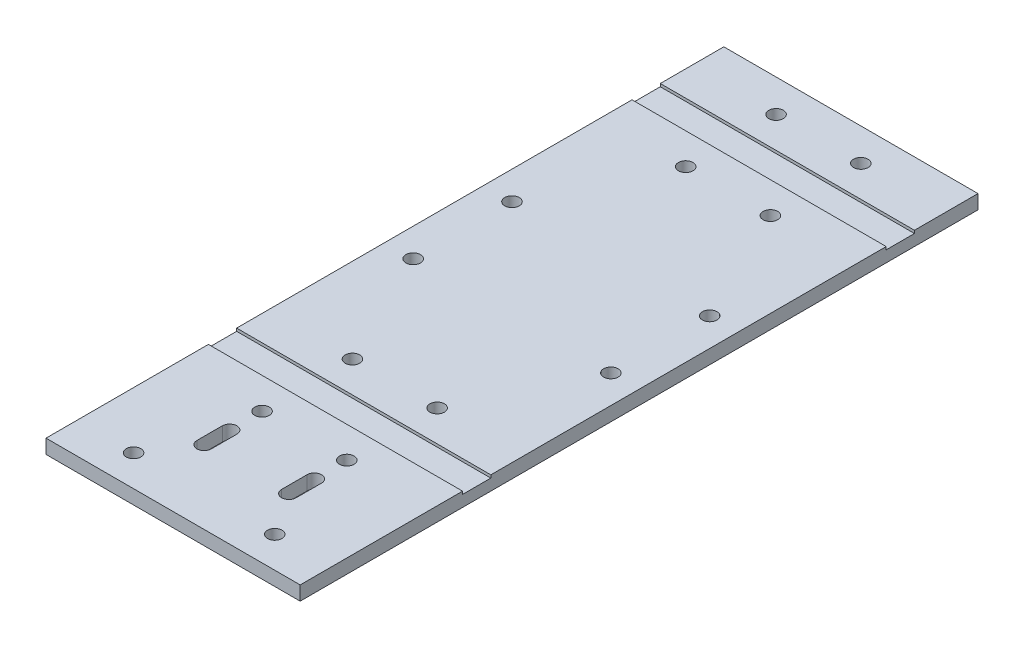
ISO-10303-21;
HEADER;
FILE_DESCRIPTION(('STEP AP214'),'2;1');
FILE_NAME('part.step','',(''),(''),'','','');
FILE_SCHEMA(('AUTOMOTIVE_DESIGN { 1 0 10303 214 1 1 1 1 }'));
ENDSEC;
DATA;
#1=APPLICATION_CONTEXT('core data for automotive mechanical design processes');
#2=APPLICATION_PROTOCOL_DEFINITION('international standard','automotive_design',2000,#1);
#3=PRODUCT_CONTEXT('',#1,'mechanical');
#4=PRODUCT('Part','Part','',(#3));
#5=PRODUCT_RELATED_PRODUCT_CATEGORY('part','',(#4));
#6=PRODUCT_DEFINITION_FORMATION('','',#4);
#7=PRODUCT_DEFINITION_CONTEXT('part definition',#1,'design');
#8=PRODUCT_DEFINITION('design','',#6,#7);
#9=PRODUCT_DEFINITION_SHAPE('','',#8);
#10=(LENGTH_UNIT() NAMED_UNIT(*) SI_UNIT(.MILLI.,.METRE.));
#11=(NAMED_UNIT(*) PLANE_ANGLE_UNIT() SI_UNIT($,.RADIAN.));
#12=(NAMED_UNIT(*) SI_UNIT($,.STERADIAN.) SOLID_ANGLE_UNIT());
#13=UNCERTAINTY_MEASURE_WITH_UNIT(LENGTH_MEASURE(1.E-05),#10,'distance_accuracy_value','');
#14=(GEOMETRIC_REPRESENTATION_CONTEXT(3) GLOBAL_UNCERTAINTY_ASSIGNED_CONTEXT((#13)) GLOBAL_UNIT_ASSIGNED_CONTEXT((#10,
#11,#12)) REPRESENTATION_CONTEXT('',''));
#15=CARTESIAN_POINT('',(0.,0.,0.));
#16=DIRECTION('',(0.,0.,1.));
#17=DIRECTION('',(1.,0.,0.));
#18=AXIS2_PLACEMENT_3D('',#15,#16,#17);
#19=CARTESIAN_POINT('',(-22.5,2.5,102.5));
#20=DIRECTION('',(0.,-1.,0.));
#21=DIRECTION('',(0.,0.,-1.));
#22=AXIS2_PLACEMENT_3D('',#19,#20,#21);
#23=PLANE('',#22);
#24=CARTESIAN_POINT('',(35.,2.5,17.5));
#25=DIRECTION('',(0.,-1.,0.));
#26=DIRECTION('',(0.,0.,1.));
#27=AXIS2_PLACEMENT_3D('',#24,#25,#26);
#28=CIRCLE('',#27,2.575);
#29=CARTESIAN_POINT('',(35.,2.5,20.075));
#30=VERTEX_POINT('',#29);
#31=EDGE_CURVE('E297',#30,#30,#28,.T.);
#32=ORIENTED_EDGE('',*,*,#31,.T.);
#33=EDGE_LOOP('',(#32));
#34=FACE_BOUND('',#33,.T.);
#35=CARTESIAN_POINT('',(35.,2.5,-17.5));
#36=DIRECTION('',(0.,-1.,0.));
#37=DIRECTION('',(0.,0.,1.));
#38=AXIS2_PLACEMENT_3D('',#35,#36,#37);
#39=CIRCLE('',#38,2.575);
#40=CARTESIAN_POINT('',(35.,2.5,-14.925));
#41=VERTEX_POINT('',#40);
#42=EDGE_CURVE('E280',#41,#41,#39,.T.);
#43=ORIENTED_EDGE('',*,*,#42,.T.);
#44=EDGE_LOOP('',(#43));
#45=FACE_BOUND('',#44,.T.);
#46=CARTESIAN_POINT('',(-35.,2.5,17.5));
#47=DIRECTION('',(0.,1.,0.));
#48=DIRECTION('',(0.,0.,1.));
#49=AXIS2_PLACEMENT_3D('',#46,#47,#48);
#50=CIRCLE('',#49,2.575);
#51=CARTESIAN_POINT('',(-35.,2.5,20.075));
#52=VERTEX_POINT('',#51);
#53=EDGE_CURVE('E313',#52,#52,#50,.T.);
#54=ORIENTED_EDGE('',*,*,#53,.F.);
#55=EDGE_LOOP('',(#54));
#56=FACE_BOUND('',#55,.T.);
#57=CARTESIAN_POINT('',(-35.,2.5,-17.5));
#58=DIRECTION('',(0.,1.,0.));
#59=DIRECTION('',(0.,0.,1.));
#60=AXIS2_PLACEMENT_3D('',#57,#58,#59);
#61=CIRCLE('',#60,2.575);
#62=CARTESIAN_POINT('',(-35.,2.5,-14.925));
#63=VERTEX_POINT('',#62);
#64=EDGE_CURVE('E317',#63,#63,#61,.T.);
#65=ORIENTED_EDGE('',*,*,#64,.F.);
#66=EDGE_LOOP('',(#65));
#67=FACE_BOUND('',#66,.T.);
#68=CARTESIAN_POINT('',(15.,2.5,59.));
#69=DIRECTION('',(0.,1.,0.));
#70=DIRECTION('',(0.,0.,1.));
#71=AXIS2_PLACEMENT_3D('',#68,#69,#70);
#72=CIRCLE('',#71,2.575);
#73=CARTESIAN_POINT('',(15.,2.5,61.575));
#74=VERTEX_POINT('',#73);
#75=EDGE_CURVE('E496',#74,#74,#72,.T.);
#76=ORIENTED_EDGE('',*,*,#75,.F.);
#77=EDGE_LOOP('',(#76));
#78=FACE_BOUND('',#77,.T.);
#79=CARTESIAN_POINT('',(-15.,2.5,59.));
#80=DIRECTION('',(0.,1.,0.));
#81=DIRECTION('',(0.,0.,1.));
#82=AXIS2_PLACEMENT_3D('',#79,#80,#81);
#83=CIRCLE('',#82,2.575);
#84=CARTESIAN_POINT('',(-15.,2.5,61.575));
#85=VERTEX_POINT('',#84);
#86=EDGE_CURVE('E48',#85,#85,#83,.T.);
#87=ORIENTED_EDGE('',*,*,#86,.F.);
#88=EDGE_LOOP('',(#87));
#89=FACE_BOUND('',#88,.T.);
#90=CARTESIAN_POINT('',(-15.,2.5,-59.));
#91=DIRECTION('',(0.,-1.,0.));
#92=DIRECTION('',(0.,0.,-1.));
#93=AXIS2_PLACEMENT_3D('',#90,#91,#92);
#94=CIRCLE('',#93,2.575);
#95=CARTESIAN_POINT('',(-15.,2.5,-61.575));
#96=VERTEX_POINT('',#95);
#97=EDGE_CURVE('E450',#96,#96,#94,.T.);
#98=ORIENTED_EDGE('',*,*,#97,.T.);
#99=EDGE_LOOP('',(#98));
#100=FACE_BOUND('',#99,.T.);
#101=CARTESIAN_POINT('',(15.,2.5,-59.));
#102=DIRECTION('',(0.,-1.,0.));
#103=DIRECTION('',(0.,0.,-1.));
#104=AXIS2_PLACEMENT_3D('',#101,#102,#103);
#105=CIRCLE('',#104,2.575);
#106=CARTESIAN_POINT('',(15.,2.5,-61.575));
#107=VERTEX_POINT('',#106);
#108=EDGE_CURVE('E451',#107,#107,#105,.T.);
#109=ORIENTED_EDGE('',*,*,#108,.T.);
#110=EDGE_LOOP('',(#109));
#111=FACE_BOUND('',#110,.T.);
#112=DIRECTION('',(1.,0.,0.));
#113=VECTOR('',#112,1.);
#114=CARTESIAN_POINT('',(-22.5,2.5,-70.));
#115=LINE('',#114,#113);
#116=CARTESIAN_POINT('',(-45.,2.5,-70.));
#117=VERTEX_POINT('',#116);
#118=CARTESIAN_POINT('',(45.,2.5,-70.));
#119=VERTEX_POINT('',#118);
#120=EDGE_CURVE('E426',#117,#119,#115,.T.);
#121=ORIENTED_EDGE('',*,*,#120,.F.);
#122=DIRECTION('',(0.,0.,1.));
#123=VECTOR('',#122,1.);
#124=CARTESIAN_POINT('',(-45.,2.5,-70.));
#125=LINE('',#124,#123);
#126=CARTESIAN_POINT('',(-45.,2.5,70.));
#127=VERTEX_POINT('',#126);
#128=EDGE_CURVE('E363',#117,#127,#125,.T.);
#129=ORIENTED_EDGE('',*,*,#128,.T.);
#130=DIRECTION('',(1.,0.,0.));
#131=VECTOR('',#130,1.);
#132=CARTESIAN_POINT('',(-22.5,2.5,70.));
#133=LINE('',#132,#131);
#134=CARTESIAN_POINT('',(45.,2.5,70.));
#135=VERTEX_POINT('',#134);
#136=EDGE_CURVE('E475',#127,#135,#133,.T.);
#137=ORIENTED_EDGE('',*,*,#136,.T.);
#138=DIRECTION('',(0.,0.,1.));
#139=VECTOR('',#138,1.);
#140=CARTESIAN_POINT('',(45.,2.5,-70.));
#141=LINE('',#140,#139);
#142=EDGE_CURVE('E379',#119,#135,#141,.T.);
#143=ORIENTED_EDGE('',*,*,#142,.F.);
#144=EDGE_LOOP('',(#121,#129,#137,#143));
#145=FACE_BOUND('',#144,.T.);
#146=ADVANCED_FACE('F44',(#34,#45,#56,#67,#78,#89,#100,#111,#145),#23,.F.);
#147=CARTESIAN_POINT('',(15.,2.5,-91.));
#148=DIRECTION('',(0.,-1.,0.));
#149=DIRECTION('',(0.,0.,-1.));
#150=AXIS2_PLACEMENT_3D('',#147,#148,#149);
#151=CIRCLE('',#150,2.575);
#152=CARTESIAN_POINT('',(15.,2.5,-93.575));
#153=VERTEX_POINT('',#152);
#154=EDGE_CURVE('E429',#153,#153,#151,.T.);
#155=ORIENTED_EDGE('',*,*,#154,.T.);
#156=EDGE_LOOP('',(#155));
#157=FACE_BOUND('',#156,.T.);
#158=CARTESIAN_POINT('',(-15.,2.5,-91.));
#159=DIRECTION('',(0.,-1.,0.));
#160=DIRECTION('',(0.,0.,-1.));
#161=AXIS2_PLACEMENT_3D('',#158,#159,#160);
#162=CIRCLE('',#161,2.575);
#163=CARTESIAN_POINT('',(-15.,2.5,-93.575));
#164=VERTEX_POINT('',#163);
#165=EDGE_CURVE('E442',#164,#164,#162,.T.);
#166=ORIENTED_EDGE('',*,*,#165,.T.);
#167=EDGE_LOOP('',(#166));
#168=FACE_BOUND('',#167,.T.);
#169=DIRECTION('',(1.,0.,0.));
#170=VECTOR('',#169,1.);
#171=CARTESIAN_POINT('',(-22.5,2.5,-80.));
#172=LINE('',#171,#170);
#173=CARTESIAN_POINT('',(-45.,2.5,-80.));
#174=VERTEX_POINT('',#173);
#175=CARTESIAN_POINT('',(45.,2.5,-80.));
#176=VERTEX_POINT('',#175);
#177=EDGE_CURVE('E430',#174,#176,#172,.T.);
#178=ORIENTED_EDGE('',*,*,#177,.T.);
#179=DIRECTION('',(0.,0.,1.));
#180=VECTOR('',#179,1.);
#181=CARTESIAN_POINT('',(45.,2.5,-102.5));
#182=LINE('',#181,#180);
#183=CARTESIAN_POINT('',(45.,2.5,-102.5));
#184=VERTEX_POINT('',#183);
#185=EDGE_CURVE('E411',#184,#176,#182,.T.);
#186=ORIENTED_EDGE('',*,*,#185,.F.);
#187=DIRECTION('',(-1.,0.,0.));
#188=VECTOR('',#187,1.);
#189=CARTESIAN_POINT('',(-22.5,2.5,-102.5));
#190=LINE('',#189,#188);
#191=CARTESIAN_POINT('',(-45.,2.5,-102.5));
#192=VERTEX_POINT('',#191);
#193=EDGE_CURVE('E472',#184,#192,#190,.T.);
#194=ORIENTED_EDGE('',*,*,#193,.T.);
#195=DIRECTION('',(0.,0.,1.));
#196=VECTOR('',#195,1.);
#197=CARTESIAN_POINT('',(-45.,2.5,-102.5));
#198=LINE('',#197,#196);
#199=EDGE_CURVE('E331',#192,#174,#198,.T.);
#200=ORIENTED_EDGE('',*,*,#199,.T.);
#201=EDGE_LOOP('',(#178,#186,#194,#200));
#202=FACE_BOUND('',#201,.T.);
#203=ADVANCED_FACE('F524',(#157,#168,#202),#23,.F.);
#204=DIRECTION('',(0.,0.,-1.));
#205=VECTOR('',#204,1.);
#206=CARTESIAN_POINT('',(-12.425,2.5,111.5));
#207=LINE('',#206,#205);
#208=CARTESIAN_POINT('',(-12.425,2.5,111.5));
#209=VERTEX_POINT('',#208);
#210=CARTESIAN_POINT('',(-12.425,2.5,102.5));
#211=VERTEX_POINT('',#210);
#212=EDGE_CURVE('E219',#209,#211,#207,.T.);
#213=ORIENTED_EDGE('',*,*,#212,.F.);
#214=CARTESIAN_POINT('',(-15.,2.5,111.5));
#215=DIRECTION('',(0.,1.,0.));
#216=DIRECTION('',(0.,0.,1.));
#217=AXIS2_PLACEMENT_3D('',#214,#215,#216);
#218=CIRCLE('',#217,2.575);
#219=CARTESIAN_POINT('',(-17.575,2.5,111.5));
#220=VERTEX_POINT('',#219);
#221=EDGE_CURVE('E60',#220,#209,#218,.T.);
#222=ORIENTED_EDGE('',*,*,#221,.F.);
#223=DIRECTION('',(0.,0.,1.));
#224=VECTOR('',#223,1.);
#225=CARTESIAN_POINT('',(-17.575,2.5,111.5));
#226=LINE('',#225,#224);
#227=CARTESIAN_POINT('',(-17.575,2.5,102.5));
#228=VERTEX_POINT('',#227);
#229=EDGE_CURVE('E206',#228,#220,#226,.T.);
#230=ORIENTED_EDGE('',*,*,#229,.F.);
#231=CARTESIAN_POINT('',(-15.,2.5,102.5));
#232=DIRECTION('',(0.,1.,0.));
#233=DIRECTION('',(0.,0.,1.));
#234=AXIS2_PLACEMENT_3D('',#231,#232,#233);
#235=CIRCLE('',#234,2.575);
#236=EDGE_CURVE('E210',#211,#228,#235,.T.);
#237=ORIENTED_EDGE('',*,*,#236,.F.);
#238=EDGE_LOOP('',(#213,#222,#230,#237));
#239=FACE_BOUND('',#238,.T.);
#240=DIRECTION('',(0.,0.,-1.));
#241=VECTOR('',#240,1.);
#242=CARTESIAN_POINT('',(17.575,2.5,111.5));
#243=LINE('',#242,#241);
#244=CARTESIAN_POINT('',(17.575,2.5,111.5));
#245=VERTEX_POINT('',#244);
#246=CARTESIAN_POINT('',(17.575,2.5,102.5));
#247=VERTEX_POINT('',#246);
#248=EDGE_CURVE('E256',#245,#247,#243,.T.);
#249=ORIENTED_EDGE('',*,*,#248,.F.);
#250=CARTESIAN_POINT('',(15.,2.5,111.5));
#251=DIRECTION('',(0.,1.,0.));
#252=DIRECTION('',(0.,0.,-1.));
#253=AXIS2_PLACEMENT_3D('',#250,#251,#252);
#254=CIRCLE('',#253,2.575);
#255=CARTESIAN_POINT('',(12.425,2.5,111.5));
#256=VERTEX_POINT('',#255);
#257=EDGE_CURVE('E68',#256,#245,#254,.T.);
#258=ORIENTED_EDGE('',*,*,#257,.F.);
#259=DIRECTION('',(0.,0.,1.));
#260=VECTOR('',#259,1.);
#261=CARTESIAN_POINT('',(12.425,2.5,111.5));
#262=LINE('',#261,#260);
#263=CARTESIAN_POINT('',(12.425,2.5,102.5));
#264=VERTEX_POINT('',#263);
#265=EDGE_CURVE('E247',#264,#256,#262,.T.);
#266=ORIENTED_EDGE('',*,*,#265,.F.);
#267=CARTESIAN_POINT('',(15.,2.5,102.5));
#268=DIRECTION('',(0.,1.,0.));
#269=DIRECTION('',(0.,0.,-1.));
#270=AXIS2_PLACEMENT_3D('',#267,#268,#269);
#271=CIRCLE('',#270,2.575);
#272=EDGE_CURVE('E251',#247,#264,#271,.T.);
#273=ORIENTED_EDGE('',*,*,#272,.F.);
#274=EDGE_LOOP('',(#249,#258,#266,#273));
#275=FACE_BOUND('',#274,.T.);
#276=CARTESIAN_POINT('',(-25.,2.5,126.5));
#277=DIRECTION('',(0.,1.,0.));
#278=DIRECTION('',(0.,0.,1.));
#279=AXIS2_PLACEMENT_3D('',#276,#277,#278);
#280=CIRCLE('',#279,2.57500000000002);
#281=CARTESIAN_POINT('',(-25.,2.5,129.075));
#282=VERTEX_POINT('',#281);
#283=EDGE_CURVE('E281',#282,#282,#280,.T.);
#284=ORIENTED_EDGE('',*,*,#283,.F.);
#285=EDGE_LOOP('',(#284));
#286=FACE_BOUND('',#285,.T.);
#287=CARTESIAN_POINT('',(25.,2.5,126.5));
#288=DIRECTION('',(0.,1.,0.));
#289=DIRECTION('',(0.,0.,-1.));
#290=AXIS2_PLACEMENT_3D('',#287,#288,#289);
#291=CIRCLE('',#290,2.57500000000002);
#292=CARTESIAN_POINT('',(25.,2.5,123.925));
#293=VERTEX_POINT('',#292);
#294=EDGE_CURVE('E285',#293,#293,#291,.T.);
#295=ORIENTED_EDGE('',*,*,#294,.F.);
#296=EDGE_LOOP('',(#295));
#297=FACE_BOUND('',#296,.T.);
#298=CARTESIAN_POINT('',(-15.,2.5,91.));
#299=DIRECTION('',(0.,1.,0.));
#300=DIRECTION('',(0.,0.,1.));
#301=AXIS2_PLACEMENT_3D('',#298,#299,#300);
#302=CIRCLE('',#301,2.575);
#303=CARTESIAN_POINT('',(-15.,2.5,93.575));
#304=VERTEX_POINT('',#303);
#305=EDGE_CURVE('E504',#304,#304,#302,.T.);
#306=ORIENTED_EDGE('',*,*,#305,.F.);
#307=EDGE_LOOP('',(#306));
#308=FACE_BOUND('',#307,.T.);
#309=CARTESIAN_POINT('',(15.,2.5,91.));
#310=DIRECTION('',(0.,1.,0.));
#311=DIRECTION('',(0.,0.,1.));
#312=AXIS2_PLACEMENT_3D('',#309,#310,#311);
#313=CIRCLE('',#312,2.575);
#314=CARTESIAN_POINT('',(15.,2.5,93.575));
#315=VERTEX_POINT('',#314);
#316=EDGE_CURVE('E488',#315,#315,#313,.T.);
#317=ORIENTED_EDGE('',*,*,#316,.F.);
#318=EDGE_LOOP('',(#317));
#319=FACE_BOUND('',#318,.T.);
#320=DIRECTION('',(-1.,0.,0.));
#321=VECTOR('',#320,1.);
#322=CARTESIAN_POINT('',(22.5,2.5,137.5));
#323=LINE('',#322,#321);
#324=CARTESIAN_POINT('',(45.,2.5,137.5));
#325=VERTEX_POINT('',#324);
#326=CARTESIAN_POINT('',(-45.,2.5,137.5));
#327=VERTEX_POINT('',#326);
#328=EDGE_CURVE('E422',#325,#327,#323,.T.);
#329=ORIENTED_EDGE('',*,*,#328,.F.);
#330=DIRECTION('',(0.,0.,1.));
#331=VECTOR('',#330,1.);
#332=CARTESIAN_POINT('',(45.,2.5,80.));
#333=LINE('',#332,#331);
#334=CARTESIAN_POINT('',(45.,2.5,80.));
#335=VERTEX_POINT('',#334);
#336=EDGE_CURVE('E395',#335,#325,#333,.T.);
#337=ORIENTED_EDGE('',*,*,#336,.F.);
#338=DIRECTION('',(1.,0.,0.));
#339=VECTOR('',#338,1.);
#340=CARTESIAN_POINT('',(-22.5,2.5,80.));
#341=LINE('',#340,#339);
#342=CARTESIAN_POINT('',(-45.,2.5,80.));
#343=VERTEX_POINT('',#342);
#344=EDGE_CURVE('E483',#343,#335,#341,.T.);
#345=ORIENTED_EDGE('',*,*,#344,.F.);
#346=DIRECTION('',(0.,0.,1.));
#347=VECTOR('',#346,1.);
#348=CARTESIAN_POINT('',(-45.,2.5,80.));
#349=LINE('',#348,#347);
#350=EDGE_CURVE('E347',#343,#327,#349,.T.);
#351=ORIENTED_EDGE('',*,*,#350,.T.);
#352=EDGE_LOOP('',(#329,#337,#345,#351));
#353=FACE_BOUND('',#352,.T.);
#354=ADVANCED_FACE('F46',(#239,#275,#286,#297,#308,#319,#353),#23,.F.);
#355=CARTESIAN_POINT('',(-22.5,-2.5,102.5));
#356=DIRECTION('',(0.,1.,0.));
#357=DIRECTION('',(0.,0.,1.));
#358=AXIS2_PLACEMENT_3D('',#355,#356,#357);
#359=PLANE('',#358);
#360=DIRECTION('',(0.,0.,1.));
#361=VECTOR('',#360,1.);
#362=CARTESIAN_POINT('',(-17.575,-2.5,111.5));
#363=LINE('',#362,#361);
#364=CARTESIAN_POINT('',(-17.575,-2.5,102.5));
#365=VERTEX_POINT('',#364);
#366=CARTESIAN_POINT('',(-17.575,-2.5,111.5));
#367=VERTEX_POINT('',#366);
#368=EDGE_CURVE('E191',#365,#367,#363,.T.);
#369=ORIENTED_EDGE('',*,*,#368,.T.);
#370=CARTESIAN_POINT('',(-15.,-2.5,111.5));
#371=DIRECTION('',(0.,1.,0.));
#372=DIRECTION('',(0.,0.,1.));
#373=AXIS2_PLACEMENT_3D('',#370,#371,#372);
#374=CIRCLE('',#373,2.575);
#375=CARTESIAN_POINT('',(-12.425,-2.5,111.5));
#376=VERTEX_POINT('',#375);
#377=EDGE_CURVE('E184',#367,#376,#374,.T.);
#378=ORIENTED_EDGE('',*,*,#377,.T.);
#379=DIRECTION('',(0.,0.,-1.));
#380=VECTOR('',#379,1.);
#381=CARTESIAN_POINT('',(-12.425,-2.5,111.5));
#382=LINE('',#381,#380);
#383=CARTESIAN_POINT('',(-12.425,-2.5,102.5));
#384=VERTEX_POINT('',#383);
#385=EDGE_CURVE('E195',#376,#384,#382,.T.);
#386=ORIENTED_EDGE('',*,*,#385,.T.);
#387=CARTESIAN_POINT('',(-15.,-2.5,102.5));
#388=DIRECTION('',(0.,1.,0.));
#389=DIRECTION('',(0.,0.,1.));
#390=AXIS2_PLACEMENT_3D('',#387,#388,#389);
#391=CIRCLE('',#390,2.575);
#392=EDGE_CURVE('E200',#384,#365,#391,.T.);
#393=ORIENTED_EDGE('',*,*,#392,.T.);
#394=EDGE_LOOP('',(#369,#378,#386,#393));
#395=FACE_BOUND('',#394,.T.);
#396=DIRECTION('',(0.,0.,1.));
#397=VECTOR('',#396,1.);
#398=CARTESIAN_POINT('',(12.425,-2.5,111.5));
#399=LINE('',#398,#397);
#400=CARTESIAN_POINT('',(12.425,-2.5,102.5));
#401=VERTEX_POINT('',#400);
#402=CARTESIAN_POINT('',(12.425,-2.5,111.5));
#403=VERTEX_POINT('',#402);
#404=EDGE_CURVE('E237',#401,#403,#399,.T.);
#405=ORIENTED_EDGE('',*,*,#404,.T.);
#406=CARTESIAN_POINT('',(15.,-2.5,111.5));
#407=DIRECTION('',(0.,1.,0.));
#408=DIRECTION('',(0.,0.,-1.));
#409=AXIS2_PLACEMENT_3D('',#406,#407,#408);
#410=CIRCLE('',#409,2.575);
#411=CARTESIAN_POINT('',(17.575,-2.5,111.5));
#412=VERTEX_POINT('',#411);
#413=EDGE_CURVE('E252',#403,#412,#410,.T.);
#414=ORIENTED_EDGE('',*,*,#413,.T.);
#415=DIRECTION('',(0.,0.,-1.));
#416=VECTOR('',#415,1.);
#417=CARTESIAN_POINT('',(17.575,-2.5,111.5));
#418=LINE('',#417,#416);
#419=CARTESIAN_POINT('',(17.575,-2.5,102.5));
#420=VERTEX_POINT('',#419);
#421=EDGE_CURVE('E269',#412,#420,#418,.T.);
#422=ORIENTED_EDGE('',*,*,#421,.T.);
#423=CARTESIAN_POINT('',(15.,-2.5,102.5));
#424=DIRECTION('',(0.,1.,0.));
#425=DIRECTION('',(0.,0.,-1.));
#426=AXIS2_PLACEMENT_3D('',#423,#424,#425);
#427=CIRCLE('',#426,2.575);
#428=EDGE_CURVE('E265',#420,#401,#427,.T.);
#429=ORIENTED_EDGE('',*,*,#428,.T.);
#430=EDGE_LOOP('',(#405,#414,#422,#429));
#431=FACE_BOUND('',#430,.T.);
#432=CARTESIAN_POINT('',(-25.,-2.5,126.5));
#433=DIRECTION('',(0.,1.,0.));
#434=DIRECTION('',(0.,0.,1.));
#435=AXIS2_PLACEMENT_3D('',#432,#433,#434);
#436=CIRCLE('',#435,2.57500000000002);
#437=CARTESIAN_POINT('',(-25.,-2.5,129.075));
#438=VERTEX_POINT('',#437);
#439=EDGE_CURVE('E276',#438,#438,#436,.T.);
#440=ORIENTED_EDGE('',*,*,#439,.T.);
#441=EDGE_LOOP('',(#440));
#442=FACE_BOUND('',#441,.T.);
#443=CARTESIAN_POINT('',(25.,-2.5,126.5));
#444=DIRECTION('',(0.,1.,0.));
#445=DIRECTION('',(0.,0.,-1.));
#446=AXIS2_PLACEMENT_3D('',#443,#444,#445);
#447=CIRCLE('',#446,2.57500000000002);
#448=CARTESIAN_POINT('',(25.,-2.5,123.925));
#449=VERTEX_POINT('',#448);
#450=EDGE_CURVE('E228',#449,#449,#447,.T.);
#451=ORIENTED_EDGE('',*,*,#450,.T.);
#452=EDGE_LOOP('',(#451));
#453=FACE_BOUND('',#452,.T.);
#454=CARTESIAN_POINT('',(35.,-2.5,17.5));
#455=DIRECTION('',(0.,-1.,0.));
#456=DIRECTION('',(0.,0.,1.));
#457=AXIS2_PLACEMENT_3D('',#454,#455,#456);
#458=CIRCLE('',#457,2.575);
#459=CARTESIAN_POINT('',(35.,-2.5,20.075));
#460=VERTEX_POINT('',#459);
#461=EDGE_CURVE('E292',#460,#460,#458,.T.);
#462=ORIENTED_EDGE('',*,*,#461,.F.);
#463=EDGE_LOOP('',(#462));
#464=FACE_BOUND('',#463,.T.);
#465=CARTESIAN_POINT('',(35.,-2.5,-17.5));
#466=DIRECTION('',(0.,-1.,0.));
#467=DIRECTION('',(0.,0.,1.));
#468=AXIS2_PLACEMENT_3D('',#465,#466,#467);
#469=CIRCLE('',#468,2.575);
#470=CARTESIAN_POINT('',(35.,-2.5,-14.925));
#471=VERTEX_POINT('',#470);
#472=EDGE_CURVE('E301',#471,#471,#469,.T.);
#473=ORIENTED_EDGE('',*,*,#472,.F.);
#474=EDGE_LOOP('',(#473));
#475=FACE_BOUND('',#474,.T.);
#476=CARTESIAN_POINT('',(-35.,-2.5,17.5));
#477=DIRECTION('',(0.,1.,0.));
#478=DIRECTION('',(0.,0.,1.));
#479=AXIS2_PLACEMENT_3D('',#476,#477,#478);
#480=CIRCLE('',#479,2.575);
#481=CARTESIAN_POINT('',(-35.,-2.5,20.075));
#482=VERTEX_POINT('',#481);
#483=EDGE_CURVE('E308',#482,#482,#480,.T.);
#484=ORIENTED_EDGE('',*,*,#483,.T.);
#485=EDGE_LOOP('',(#484));
#486=FACE_BOUND('',#485,.T.);
#487=CARTESIAN_POINT('',(-35.,-2.5,-17.5));
#488=DIRECTION('',(0.,1.,0.));
#489=DIRECTION('',(0.,0.,1.));
#490=AXIS2_PLACEMENT_3D('',#487,#488,#489);
#491=CIRCLE('',#490,2.575);
#492=CARTESIAN_POINT('',(-35.,-2.5,-14.925));
#493=VERTEX_POINT('',#492);
#494=EDGE_CURVE('E296',#493,#493,#491,.T.);
#495=ORIENTED_EDGE('',*,*,#494,.T.);
#496=EDGE_LOOP('',(#495));
#497=FACE_BOUND('',#496,.T.);
#498=CARTESIAN_POINT('',(15.,-2.5,-59.));
#499=DIRECTION('',(0.,-1.,0.));
#500=DIRECTION('',(0.,0.,-1.));
#501=AXIS2_PLACEMENT_3D('',#498,#499,#500);
#502=CIRCLE('',#501,2.575);
#503=CARTESIAN_POINT('',(15.,-2.5,-61.575));
#504=VERTEX_POINT('',#503);
#505=EDGE_CURVE('E446',#504,#504,#502,.T.);
#506=ORIENTED_EDGE('',*,*,#505,.F.);
#507=EDGE_LOOP('',(#506));
#508=FACE_BOUND('',#507,.T.);
#509=CARTESIAN_POINT('',(-15.,-2.5,-91.));
#510=DIRECTION('',(0.,-1.,0.));
#511=DIRECTION('',(0.,0.,-1.));
#512=AXIS2_PLACEMENT_3D('',#509,#510,#511);
#513=CIRCLE('',#512,2.575);
#514=CARTESIAN_POINT('',(-15.,-2.5,-93.575));
#515=VERTEX_POINT('',#514);
#516=EDGE_CURVE('E455',#515,#515,#513,.T.);
#517=ORIENTED_EDGE('',*,*,#516,.F.);
#518=EDGE_LOOP('',(#517));
#519=FACE_BOUND('',#518,.T.);
#520=CARTESIAN_POINT('',(15.,-2.5,-91.));
#521=DIRECTION('',(0.,-1.,0.));
#522=DIRECTION('',(0.,0.,-1.));
#523=AXIS2_PLACEMENT_3D('',#520,#521,#522);
#524=CIRCLE('',#523,2.575);
#525=CARTESIAN_POINT('',(15.,-2.5,-93.575));
#526=VERTEX_POINT('',#525);
#527=EDGE_CURVE('E438',#526,#526,#524,.T.);
#528=ORIENTED_EDGE('',*,*,#527,.F.);
#529=EDGE_LOOP('',(#528));
#530=FACE_BOUND('',#529,.T.);
#531=CARTESIAN_POINT('',(-15.,-2.5,-59.));
#532=DIRECTION('',(0.,-1.,0.));
#533=DIRECTION('',(0.,0.,-1.));
#534=AXIS2_PLACEMENT_3D('',#531,#532,#533);
#535=CIRCLE('',#534,2.575);
#536=CARTESIAN_POINT('',(-15.,-2.5,-61.575));
#537=VERTEX_POINT('',#536);
#538=EDGE_CURVE('E462',#537,#537,#535,.T.);
#539=ORIENTED_EDGE('',*,*,#538,.F.);
#540=EDGE_LOOP('',(#539));
#541=FACE_BOUND('',#540,.T.);
#542=CARTESIAN_POINT('',(15.,-2.5,59.));
#543=DIRECTION('',(0.,1.,0.));
#544=DIRECTION('',(0.,0.,1.));
#545=AXIS2_PLACEMENT_3D('',#542,#543,#544);
#546=CIRCLE('',#545,2.575);
#547=CARTESIAN_POINT('',(15.,-2.5,61.575));
#548=VERTEX_POINT('',#547);
#549=EDGE_CURVE('E500',#548,#548,#546,.T.);
#550=ORIENTED_EDGE('',*,*,#549,.T.);
#551=EDGE_LOOP('',(#550));
#552=FACE_BOUND('',#551,.T.);
#553=CARTESIAN_POINT('',(-15.,-2.5,91.));
#554=DIRECTION('',(0.,1.,0.));
#555=DIRECTION('',(0.,0.,1.));
#556=AXIS2_PLACEMENT_3D('',#553,#554,#555);
#557=CIRCLE('',#556,2.575);
#558=CARTESIAN_POINT('',(-15.,-2.5,93.575));
#559=VERTEX_POINT('',#558);
#560=EDGE_CURVE('E492',#559,#559,#557,.T.);
#561=ORIENTED_EDGE('',*,*,#560,.T.);
#562=EDGE_LOOP('',(#561));
#563=FACE_BOUND('',#562,.T.);
#564=CARTESIAN_POINT('',(15.,-2.5,91.));
#565=DIRECTION('',(0.,1.,0.));
#566=DIRECTION('',(0.,0.,1.));
#567=AXIS2_PLACEMENT_3D('',#564,#565,#566);
#568=CIRCLE('',#567,2.575);
#569=CARTESIAN_POINT('',(15.,-2.5,93.575));
#570=VERTEX_POINT('',#569);
#571=EDGE_CURVE('E479',#570,#570,#568,.T.);
#572=ORIENTED_EDGE('',*,*,#571,.T.);
#573=EDGE_LOOP('',(#572));
#574=FACE_BOUND('',#573,.T.);
#575=CARTESIAN_POINT('',(-15.,-2.5,59.));
#576=DIRECTION('',(0.,1.,0.));
#577=DIRECTION('',(0.,0.,1.));
#578=AXIS2_PLACEMENT_3D('',#575,#576,#577);
#579=CIRCLE('',#578,2.575);
#580=CARTESIAN_POINT('',(-15.,-2.5,61.575));
#581=VERTEX_POINT('',#580);
#582=EDGE_CURVE('E11',#581,#581,#579,.T.);
#583=ORIENTED_EDGE('',*,*,#582,.T.);
#584=EDGE_LOOP('',(#583));
#585=FACE_BOUND('',#584,.T.);
#586=DIRECTION('',(1.,0.,0.));
#587=VECTOR('',#586,1.);
#588=CARTESIAN_POINT('',(-22.5,-2.5,137.5));
#589=LINE('',#588,#587);
#590=CARTESIAN_POINT('',(-45.,-2.5,137.5));
#591=VERTEX_POINT('',#590);
#592=CARTESIAN_POINT('',(45.,-2.5,137.5));
#593=VERTEX_POINT('',#592);
#594=EDGE_CURVE('E419',#591,#593,#589,.T.);
#595=ORIENTED_EDGE('',*,*,#594,.F.);
#596=DIRECTION('',(0.,0.,-1.));
#597=VECTOR('',#596,1.);
#598=CARTESIAN_POINT('',(-45.,-2.5,137.5));
#599=LINE('',#598,#597);
#600=CARTESIAN_POINT('',(-45.,-2.5,-102.5));
#601=VERTEX_POINT('',#600);
#602=EDGE_CURVE('E339',#591,#601,#599,.T.);
#603=ORIENTED_EDGE('',*,*,#602,.T.);
#604=DIRECTION('',(1.,0.,0.));
#605=VECTOR('',#604,1.);
#606=CARTESIAN_POINT('',(-22.5,-2.5,-102.5));
#607=LINE('',#606,#605);
#608=CARTESIAN_POINT('',(45.,-2.5,-102.5));
#609=VERTEX_POINT('',#608);
#610=EDGE_CURVE('E466',#601,#609,#607,.T.);
#611=ORIENTED_EDGE('',*,*,#610,.T.);
#612=DIRECTION('',(0.,0.,-1.));
#613=VECTOR('',#612,1.);
#614=CARTESIAN_POINT('',(45.,-2.5,137.5));
#615=LINE('',#614,#613);
#616=EDGE_CURVE('E403',#593,#609,#615,.T.);
#617=ORIENTED_EDGE('',*,*,#616,.F.);
#618=EDGE_LOOP('',(#595,#603,#611,#617));
#619=FACE_BOUND('',#618,.T.);
#620=ADVANCED_FACE('F202',(#395,#431,#442,#453,#464,#475,#486,#497,#508,#519,#530,#541,#552,
#563,#574,#585,#619),#359,.F.);
#621=CARTESIAN_POINT('',(-15.,-2.5,59.));
#622=DIRECTION('',(0.,1.,0.));
#623=DIRECTION('',(0.,0.,1.));
#624=AXIS2_PLACEMENT_3D('',#621,#622,#623);
#625=CYLINDRICAL_SURFACE('',#624,2.575);
#626=ORIENTED_EDGE('',*,*,#582,.F.);
#627=EDGE_LOOP('',(#626));
#628=FACE_BOUND('',#627,.T.);
#629=ORIENTED_EDGE('',*,*,#86,.T.);
#630=EDGE_LOOP('',(#629));
#631=FACE_BOUND('',#630,.T.);
#632=ADVANCED_FACE('F636',(#628,#631),#625,.F.);
#633=CARTESIAN_POINT('',(15.,-2.5,91.));
#634=DIRECTION('',(0.,1.,0.));
#635=DIRECTION('',(0.,0.,1.));
#636=AXIS2_PLACEMENT_3D('',#633,#634,#635);
#637=CYLINDRICAL_SURFACE('',#636,2.575);
#638=ORIENTED_EDGE('',*,*,#571,.F.);
#639=EDGE_LOOP('',(#638));
#640=FACE_BOUND('',#639,.T.);
#641=ORIENTED_EDGE('',*,*,#316,.T.);
#642=EDGE_LOOP('',(#641));
#643=FACE_BOUND('',#642,.T.);
#644=ADVANCED_FACE('F518',(#640,#643),#637,.F.);
#645=CARTESIAN_POINT('',(-15.,-2.5,91.));
#646=DIRECTION('',(0.,1.,0.));
#647=DIRECTION('',(0.,0.,1.));
#648=AXIS2_PLACEMENT_3D('',#645,#646,#647);
#649=CYLINDRICAL_SURFACE('',#648,2.575);
#650=ORIENTED_EDGE('',*,*,#560,.F.);
#651=EDGE_LOOP('',(#650));
#652=FACE_BOUND('',#651,.T.);
#653=ORIENTED_EDGE('',*,*,#305,.T.);
#654=EDGE_LOOP('',(#653));
#655=FACE_BOUND('',#654,.T.);
#656=ADVANCED_FACE('F514',(#652,#655),#649,.F.);
#657=CARTESIAN_POINT('',(15.,-2.5,59.));
#658=DIRECTION('',(0.,1.,0.));
#659=DIRECTION('',(0.,0.,1.));
#660=AXIS2_PLACEMENT_3D('',#657,#658,#659);
#661=CYLINDRICAL_SURFACE('',#660,2.575);
#662=ORIENTED_EDGE('',*,*,#549,.F.);
#663=EDGE_LOOP('',(#662));
#664=FACE_BOUND('',#663,.T.);
#665=ORIENTED_EDGE('',*,*,#75,.T.);
#666=EDGE_LOOP('',(#665));
#667=FACE_BOUND('',#666,.T.);
#668=ADVANCED_FACE('F517',(#664,#667),#661,.F.);
#669=CARTESIAN_POINT('',(-22.5,2.5,70.));
#670=DIRECTION('',(0.,0.,-1.));
#671=DIRECTION('',(-1.,0.,0.));
#672=AXIS2_PLACEMENT_3D('',#669,#670,#671);
#673=PLANE('',#672);
#674=DIRECTION('',(1.,0.,0.));
#675=VECTOR('',#674,1.);
#676=CARTESIAN_POINT('',(-22.5,1.5,70.));
#677=LINE('',#676,#675);
#678=CARTESIAN_POINT('',(-45.,1.5,70.));
#679=VERTEX_POINT('',#678);
#680=CARTESIAN_POINT('',(45.,1.5,70.));
#681=VERTEX_POINT('',#680);
#682=EDGE_CURVE('E476',#679,#681,#677,.T.);
#683=ORIENTED_EDGE('',*,*,#682,.T.);
#684=DIRECTION('',(0.,-1.,0.));
#685=VECTOR('',#684,1.);
#686=CARTESIAN_POINT('',(45.,2.5,70.));
#687=LINE('',#686,#685);
#688=EDGE_CURVE('E383',#135,#681,#687,.T.);
#689=ORIENTED_EDGE('',*,*,#688,.F.);
#690=ORIENTED_EDGE('',*,*,#136,.F.);
#691=DIRECTION('',(0.,-1.,0.));
#692=VECTOR('',#691,1.);
#693=CARTESIAN_POINT('',(-45.,2.5,70.));
#694=LINE('',#693,#692);
#695=EDGE_CURVE('E359',#127,#679,#694,.T.);
#696=ORIENTED_EDGE('',*,*,#695,.T.);
#697=EDGE_LOOP('',(#683,#689,#690,#696));
#698=FACE_BOUND('',#697,.T.);
#699=ADVANCED_FACE('F566',(#698),#673,.F.);
#700=CARTESIAN_POINT('',(-22.5,1.5,70.));
#701=DIRECTION('',(0.,-1.,0.));
#702=DIRECTION('',(0.,0.,-1.));
#703=AXIS2_PLACEMENT_3D('',#700,#701,#702);
#704=PLANE('',#703);
#705=DIRECTION('',(1.,0.,0.));
#706=VECTOR('',#705,1.);
#707=CARTESIAN_POINT('',(-22.5,1.5,80.));
#708=LINE('',#707,#706);
#709=CARTESIAN_POINT('',(-45.,1.5,80.));
#710=VERTEX_POINT('',#709);
#711=CARTESIAN_POINT('',(45.,1.5,80.));
#712=VERTEX_POINT('',#711);
#713=EDGE_CURVE('E480',#710,#712,#708,.T.);
#714=ORIENTED_EDGE('',*,*,#713,.T.);
#715=DIRECTION('',(0.,0.,1.));
#716=VECTOR('',#715,1.);
#717=CARTESIAN_POINT('',(45.,1.5,70.));
#718=LINE('',#717,#716);
#719=EDGE_CURVE('E387',#681,#712,#718,.T.);
#720=ORIENTED_EDGE('',*,*,#719,.F.);
#721=ORIENTED_EDGE('',*,*,#682,.F.);
#722=DIRECTION('',(0.,0.,1.));
#723=VECTOR('',#722,1.);
#724=CARTESIAN_POINT('',(-45.,1.5,70.));
#725=LINE('',#724,#723);
#726=EDGE_CURVE('E355',#679,#710,#725,.T.);
#727=ORIENTED_EDGE('',*,*,#726,.T.);
#728=EDGE_LOOP('',(#714,#720,#721,#727));
#729=FACE_BOUND('',#728,.T.);
#730=ADVANCED_FACE('F570',(#729),#704,.F.);
#731=CARTESIAN_POINT('',(-22.5,2.5,80.));
#732=DIRECTION('',(0.,0.,1.));
#733=DIRECTION('',(1.,0.,0.));
#734=AXIS2_PLACEMENT_3D('',#731,#732,#733);
#735=PLANE('',#734);
#736=ORIENTED_EDGE('',*,*,#344,.T.);
#737=DIRECTION('',(0.,1.,0.));
#738=VECTOR('',#737,1.);
#739=CARTESIAN_POINT('',(45.,1.5,80.));
#740=LINE('',#739,#738);
#741=EDGE_CURVE('E391',#712,#335,#740,.T.);
#742=ORIENTED_EDGE('',*,*,#741,.F.);
#743=ORIENTED_EDGE('',*,*,#713,.F.);
#744=DIRECTION('',(0.,1.,0.));
#745=VECTOR('',#744,1.);
#746=CARTESIAN_POINT('',(-45.,1.5,80.));
#747=LINE('',#746,#745);
#748=EDGE_CURVE('E351',#710,#343,#747,.T.);
#749=ORIENTED_EDGE('',*,*,#748,.T.);
#750=EDGE_LOOP('',(#736,#742,#743,#749));
#751=FACE_BOUND('',#750,.T.);
#752=ADVANCED_FACE('F573',(#751),#735,.F.);
#753=CARTESIAN_POINT('',(0.,0.,-102.5));
#754=DIRECTION('',(0.,0.,1.));
#755=DIRECTION('',(-1.,0.,0.));
#756=AXIS2_PLACEMENT_3D('',#753,#754,#755);
#757=PLANE('',#756);
#758=ORIENTED_EDGE('',*,*,#193,.F.);
#759=DIRECTION('',(0.,1.,0.));
#760=VECTOR('',#759,1.);
#761=CARTESIAN_POINT('',(45.,-2.5,-102.5));
#762=LINE('',#761,#760);
#763=EDGE_CURVE('E407',#609,#184,#762,.T.);
#764=ORIENTED_EDGE('',*,*,#763,.F.);
#765=ORIENTED_EDGE('',*,*,#610,.F.);
#766=DIRECTION('',(0.,1.,0.));
#767=VECTOR('',#766,1.);
#768=CARTESIAN_POINT('',(-45.,-2.5,-102.5));
#769=LINE('',#768,#767);
#770=EDGE_CURVE('E335',#601,#192,#769,.T.);
#771=ORIENTED_EDGE('',*,*,#770,.T.);
#772=EDGE_LOOP('',(#758,#764,#765,#771));
#773=FACE_BOUND('',#772,.T.);
#774=ADVANCED_FACE('F547',(#773),#757,.F.);
#775=CARTESIAN_POINT('',(-15.,-2.5,-59.));
#776=DIRECTION('',(0.,1.,0.));
#777=DIRECTION('',(0.,0.,1.));
#778=AXIS2_PLACEMENT_3D('',#775,#776,#777);
#779=CYLINDRICAL_SURFACE('',#778,2.575);
#780=ORIENTED_EDGE('',*,*,#538,.T.);
#781=EDGE_LOOP('',(#780));
#782=FACE_BOUND('',#781,.T.);
#783=ORIENTED_EDGE('',*,*,#97,.F.);
#784=EDGE_LOOP('',(#783));
#785=FACE_BOUND('',#784,.T.);
#786=ADVANCED_FACE('F580',(#782,#785),#779,.F.);
#787=CARTESIAN_POINT('',(15.,-2.5,-91.));
#788=DIRECTION('',(0.,1.,0.));
#789=DIRECTION('',(0.,0.,1.));
#790=AXIS2_PLACEMENT_3D('',#787,#788,#789);
#791=CYLINDRICAL_SURFACE('',#790,2.575);
#792=ORIENTED_EDGE('',*,*,#527,.T.);
#793=EDGE_LOOP('',(#792));
#794=FACE_BOUND('',#793,.T.);
#795=ORIENTED_EDGE('',*,*,#154,.F.);
#796=EDGE_LOOP('',(#795));
#797=FACE_BOUND('',#796,.T.);
#798=ADVANCED_FACE('F620',(#794,#797),#791,.F.);
#799=CARTESIAN_POINT('',(-15.,-2.5,-91.));
#800=DIRECTION('',(0.,1.,0.));
#801=DIRECTION('',(0.,0.,1.));
#802=AXIS2_PLACEMENT_3D('',#799,#800,#801);
#803=CYLINDRICAL_SURFACE('',#802,2.575);
#804=ORIENTED_EDGE('',*,*,#516,.T.);
#805=EDGE_LOOP('',(#804));
#806=FACE_BOUND('',#805,.T.);
#807=ORIENTED_EDGE('',*,*,#165,.F.);
#808=EDGE_LOOP('',(#807));
#809=FACE_BOUND('',#808,.T.);
#810=ADVANCED_FACE('F612',(#806,#809),#803,.F.);
#811=CARTESIAN_POINT('',(15.,-2.5,-59.));
#812=DIRECTION('',(0.,1.,0.));
#813=DIRECTION('',(0.,0.,1.));
#814=AXIS2_PLACEMENT_3D('',#811,#812,#813);
#815=CYLINDRICAL_SURFACE('',#814,2.575);
#816=ORIENTED_EDGE('',*,*,#505,.T.);
#817=EDGE_LOOP('',(#816));
#818=FACE_BOUND('',#817,.T.);
#819=ORIENTED_EDGE('',*,*,#108,.F.);
#820=EDGE_LOOP('',(#819));
#821=FACE_BOUND('',#820,.T.);
#822=ADVANCED_FACE('F609',(#818,#821),#815,.F.);
#823=CARTESIAN_POINT('',(-22.5,2.5,-70.));
#824=DIRECTION('',(0.,0.,-1.));
#825=DIRECTION('',(-1.,0.,0.));
#826=AXIS2_PLACEMENT_3D('',#823,#824,#825);
#827=PLANE('',#826);
#828=ORIENTED_EDGE('',*,*,#120,.T.);
#829=DIRECTION('',(0.,1.,0.));
#830=VECTOR('',#829,1.);
#831=CARTESIAN_POINT('',(45.,1.5,-70.));
#832=LINE('',#831,#830);
#833=CARTESIAN_POINT('',(45.,1.5,-70.));
#834=VERTEX_POINT('',#833);
#835=EDGE_CURVE('E375',#834,#119,#832,.T.);
#836=ORIENTED_EDGE('',*,*,#835,.F.);
#837=DIRECTION('',(1.,0.,0.));
#838=VECTOR('',#837,1.);
#839=CARTESIAN_POINT('',(-22.5,1.5,-70.));
#840=LINE('',#839,#838);
#841=CARTESIAN_POINT('',(-45.,1.5,-70.));
#842=VERTEX_POINT('',#841);
#843=EDGE_CURVE('E425',#842,#834,#840,.T.);
#844=ORIENTED_EDGE('',*,*,#843,.F.);
#845=DIRECTION('',(0.,1.,0.));
#846=VECTOR('',#845,1.);
#847=CARTESIAN_POINT('',(-45.,1.5,-70.));
#848=LINE('',#847,#846);
#849=EDGE_CURVE('E367',#842,#117,#848,.T.);
#850=ORIENTED_EDGE('',*,*,#849,.T.);
#851=EDGE_LOOP('',(#828,#836,#844,#850));
#852=FACE_BOUND('',#851,.T.);
#853=ADVANCED_FACE('F611',(#852),#827,.T.);
#854=CARTESIAN_POINT('',(-22.5,2.5,-80.));
#855=DIRECTION('',(0.,0.,1.));
#856=DIRECTION('',(1.,0.,0.));
#857=AXIS2_PLACEMENT_3D('',#854,#855,#856);
#858=PLANE('',#857);
#859=DIRECTION('',(1.,0.,0.));
#860=VECTOR('',#859,1.);
#861=CARTESIAN_POINT('',(-22.5,1.5,-80.));
#862=LINE('',#861,#860);
#863=CARTESIAN_POINT('',(-45.,1.5,-80.));
#864=VERTEX_POINT('',#863);
#865=CARTESIAN_POINT('',(45.,1.5,-80.));
#866=VERTEX_POINT('',#865);
#867=EDGE_CURVE('E433',#864,#866,#862,.T.);
#868=ORIENTED_EDGE('',*,*,#867,.T.);
#869=DIRECTION('',(0.,-1.,0.));
#870=VECTOR('',#869,1.);
#871=CARTESIAN_POINT('',(45.,2.5,-80.));
#872=LINE('',#871,#870);
#873=EDGE_CURVE('E415',#176,#866,#872,.T.);
#874=ORIENTED_EDGE('',*,*,#873,.F.);
#875=ORIENTED_EDGE('',*,*,#177,.F.);
#876=DIRECTION('',(0.,-1.,0.));
#877=VECTOR('',#876,1.);
#878=CARTESIAN_POINT('',(-45.,2.5,-80.));
#879=LINE('',#878,#877);
#880=EDGE_CURVE('E327',#174,#864,#879,.T.);
#881=ORIENTED_EDGE('',*,*,#880,.T.);
#882=EDGE_LOOP('',(#868,#874,#875,#881));
#883=FACE_BOUND('',#882,.T.);
#884=ADVANCED_FACE('F553',(#883),#858,.T.);
#885=CARTESIAN_POINT('',(-22.5,1.5,-70.));
#886=DIRECTION('',(0.,1.,0.));
#887=DIRECTION('',(0.,0.,1.));
#888=AXIS2_PLACEMENT_3D('',#885,#886,#887);
#889=PLANE('',#888);
#890=ORIENTED_EDGE('',*,*,#843,.T.);
#891=DIRECTION('',(0.,0.,1.));
#892=VECTOR('',#891,1.);
#893=CARTESIAN_POINT('',(45.,1.5,-80.));
#894=LINE('',#893,#892);
#895=EDGE_CURVE('E371',#866,#834,#894,.T.);
#896=ORIENTED_EDGE('',*,*,#895,.F.);
#897=ORIENTED_EDGE('',*,*,#867,.F.);
#898=DIRECTION('',(0.,0.,1.));
#899=VECTOR('',#898,1.);
#900=CARTESIAN_POINT('',(-45.,1.5,-80.));
#901=LINE('',#900,#899);
#902=EDGE_CURVE('E312',#864,#842,#901,.T.);
#903=ORIENTED_EDGE('',*,*,#902,.T.);
#904=EDGE_LOOP('',(#890,#896,#897,#903));
#905=FACE_BOUND('',#904,.T.);
#906=ADVANCED_FACE('F557',(#905),#889,.T.);
#907=CARTESIAN_POINT('',(0.,0.,137.5));
#908=DIRECTION('',(0.,0.,1.));
#909=DIRECTION('',(1.,0.,0.));
#910=AXIS2_PLACEMENT_3D('',#907,#908,#909);
#911=PLANE('',#910);
#912=ORIENTED_EDGE('',*,*,#594,.T.);
#913=DIRECTION('',(0.,-1.,0.));
#914=VECTOR('',#913,1.);
#915=CARTESIAN_POINT('',(45.,2.5,137.5));
#916=LINE('',#915,#914);
#917=EDGE_CURVE('E399',#325,#593,#916,.T.);
#918=ORIENTED_EDGE('',*,*,#917,.F.);
#919=ORIENTED_EDGE('',*,*,#328,.T.);
#920=DIRECTION('',(0.,-1.,0.));
#921=VECTOR('',#920,1.);
#922=CARTESIAN_POINT('',(-45.,2.5,137.5));
#923=LINE('',#922,#921);
#924=EDGE_CURVE('E343',#327,#591,#923,.T.);
#925=ORIENTED_EDGE('',*,*,#924,.T.);
#926=EDGE_LOOP('',(#912,#918,#919,#925));
#927=FACE_BOUND('',#926,.T.);
#928=ADVANCED_FACE('F537',(#927),#911,.T.);
#929=CARTESIAN_POINT('',(45.,0.,0.));
#930=DIRECTION('',(-1.,0.,0.));
#931=DIRECTION('',(0.,0.,1.));
#932=AXIS2_PLACEMENT_3D('',#929,#930,#931);
#933=PLANE('',#932);
#934=ORIENTED_EDGE('',*,*,#895,.T.);
#935=ORIENTED_EDGE('',*,*,#835,.T.);
#936=ORIENTED_EDGE('',*,*,#142,.T.);
#937=ORIENTED_EDGE('',*,*,#688,.T.);
#938=ORIENTED_EDGE('',*,*,#719,.T.);
#939=ORIENTED_EDGE('',*,*,#741,.T.);
#940=ORIENTED_EDGE('',*,*,#336,.T.);
#941=ORIENTED_EDGE('',*,*,#917,.T.);
#942=ORIENTED_EDGE('',*,*,#616,.T.);
#943=ORIENTED_EDGE('',*,*,#763,.T.);
#944=ORIENTED_EDGE('',*,*,#185,.T.);
#945=ORIENTED_EDGE('',*,*,#873,.T.);
#946=EDGE_LOOP('',(#934,#935,#936,#937,#938,#939,#940,#941,#942,#943,#944,#945));
#947=FACE_BOUND('',#946,.T.);
#948=ADVANCED_FACE('F534',(#947),#933,.F.);
#949=CARTESIAN_POINT('',(-45.,0.,0.));
#950=DIRECTION('',(1.,0.,0.));
#951=DIRECTION('',(0.,0.,1.));
#952=AXIS2_PLACEMENT_3D('',#949,#950,#951);
#953=PLANE('',#952);
#954=ORIENTED_EDGE('',*,*,#902,.F.);
#955=ORIENTED_EDGE('',*,*,#880,.F.);
#956=ORIENTED_EDGE('',*,*,#199,.F.);
#957=ORIENTED_EDGE('',*,*,#770,.F.);
#958=ORIENTED_EDGE('',*,*,#602,.F.);
#959=ORIENTED_EDGE('',*,*,#924,.F.);
#960=ORIENTED_EDGE('',*,*,#350,.F.);
#961=ORIENTED_EDGE('',*,*,#748,.F.);
#962=ORIENTED_EDGE('',*,*,#726,.F.);
#963=ORIENTED_EDGE('',*,*,#695,.F.);
#964=ORIENTED_EDGE('',*,*,#128,.F.);
#965=ORIENTED_EDGE('',*,*,#849,.F.);
#966=EDGE_LOOP('',(#954,#955,#956,#957,#958,#959,#960,#961,#962,#963,#964,#965));
#967=FACE_BOUND('',#966,.T.);
#968=ADVANCED_FACE('F543',(#967),#953,.F.);
#969=CARTESIAN_POINT('',(-35.,-2.5,-17.5));
#970=DIRECTION('',(0.,1.,0.));
#971=DIRECTION('',(0.,0.,1.));
#972=AXIS2_PLACEMENT_3D('',#969,#970,#971);
#973=CYLINDRICAL_SURFACE('',#972,2.575);
#974=ORIENTED_EDGE('',*,*,#494,.F.);
#975=EDGE_LOOP('',(#974));
#976=FACE_BOUND('',#975,.T.);
#977=ORIENTED_EDGE('',*,*,#64,.T.);
#978=EDGE_LOOP('',(#977));
#979=FACE_BOUND('',#978,.T.);
#980=ADVANCED_FACE('F797',(#976,#979),#973,.F.);
#981=CARTESIAN_POINT('',(-35.,-2.5,17.5));
#982=DIRECTION('',(0.,1.,0.));
#983=DIRECTION('',(0.,0.,1.));
#984=AXIS2_PLACEMENT_3D('',#981,#982,#983);
#985=CYLINDRICAL_SURFACE('',#984,2.575);
#986=ORIENTED_EDGE('',*,*,#483,.F.);
#987=EDGE_LOOP('',(#986));
#988=FACE_BOUND('',#987,.T.);
#989=ORIENTED_EDGE('',*,*,#53,.T.);
#990=EDGE_LOOP('',(#989));
#991=FACE_BOUND('',#990,.T.);
#992=ADVANCED_FACE('F806',(#988,#991),#985,.F.);
#993=CARTESIAN_POINT('',(35.,-2.5,-17.5));
#994=DIRECTION('',(0.,1.,0.));
#995=DIRECTION('',(0.,0.,1.));
#996=AXIS2_PLACEMENT_3D('',#993,#994,#995);
#997=CYLINDRICAL_SURFACE('',#996,2.575);
#998=ORIENTED_EDGE('',*,*,#472,.T.);
#999=EDGE_LOOP('',(#998));
#1000=FACE_BOUND('',#999,.T.);
#1001=ORIENTED_EDGE('',*,*,#42,.F.);
#1002=EDGE_LOOP('',(#1001));
#1003=FACE_BOUND('',#1002,.T.);
#1004=ADVANCED_FACE('F816',(#1000,#1003),#997,.F.);
#1005=CARTESIAN_POINT('',(35.,-2.5,17.5));
#1006=DIRECTION('',(0.,1.,0.));
#1007=DIRECTION('',(0.,0.,1.));
#1008=AXIS2_PLACEMENT_3D('',#1005,#1006,#1007);
#1009=CYLINDRICAL_SURFACE('',#1008,2.575);
#1010=ORIENTED_EDGE('',*,*,#461,.T.);
#1011=EDGE_LOOP('',(#1010));
#1012=FACE_BOUND('',#1011,.T.);
#1013=ORIENTED_EDGE('',*,*,#31,.F.);
#1014=EDGE_LOOP('',(#1013));
#1015=FACE_BOUND('',#1014,.T.);
#1016=ADVANCED_FACE('F827',(#1012,#1015),#1009,.F.);
#1017=CARTESIAN_POINT('',(25.,-2.5,126.5));
#1018=DIRECTION('',(0.,1.,0.));
#1019=DIRECTION('',(0.,0.,1.));
#1020=AXIS2_PLACEMENT_3D('',#1017,#1018,#1019);
#1021=CYLINDRICAL_SURFACE('',#1020,2.57500000000002);
#1022=ORIENTED_EDGE('',*,*,#450,.F.);
#1023=EDGE_LOOP('',(#1022));
#1024=FACE_BOUND('',#1023,.T.);
#1025=ORIENTED_EDGE('',*,*,#294,.T.);
#1026=EDGE_LOOP('',(#1025));
#1027=FACE_BOUND('',#1026,.T.);
#1028=ADVANCED_FACE('F834',(#1024,#1027),#1021,.F.);
#1029=CARTESIAN_POINT('',(-25.,-2.5,126.5));
#1030=DIRECTION('',(0.,1.,0.));
#1031=DIRECTION('',(0.,0.,1.));
#1032=AXIS2_PLACEMENT_3D('',#1029,#1030,#1031);
#1033=CYLINDRICAL_SURFACE('',#1032,2.57500000000002);
#1034=ORIENTED_EDGE('',*,*,#439,.F.);
#1035=EDGE_LOOP('',(#1034));
#1036=FACE_BOUND('',#1035,.T.);
#1037=ORIENTED_EDGE('',*,*,#283,.T.);
#1038=EDGE_LOOP('',(#1037));
#1039=FACE_BOUND('',#1038,.T.);
#1040=ADVANCED_FACE('F842',(#1036,#1039),#1033,.F.);
#1041=CARTESIAN_POINT('',(15.,-2.5,111.5));
#1042=DIRECTION('',(0.,1.,0.));
#1043=DIRECTION('',(0.,0.,1.));
#1044=AXIS2_PLACEMENT_3D('',#1041,#1042,#1043);
#1045=CYLINDRICAL_SURFACE('',#1044,2.575);
#1046=ORIENTED_EDGE('',*,*,#257,.T.);
#1047=DIRECTION('',(0.,1.,0.));
#1048=VECTOR('',#1047,1.);
#1049=CARTESIAN_POINT('',(17.575,-2.5,111.5));
#1050=LINE('',#1049,#1048);
#1051=EDGE_CURVE('E234',#412,#245,#1050,.T.);
#1052=ORIENTED_EDGE('',*,*,#1051,.F.);
#1053=ORIENTED_EDGE('',*,*,#413,.F.);
#1054=DIRECTION('',(0.,1.,0.));
#1055=VECTOR('',#1054,1.);
#1056=CARTESIAN_POINT('',(12.425,-2.5,111.5));
#1057=LINE('',#1056,#1055);
#1058=EDGE_CURVE('E244',#403,#256,#1057,.T.);
#1059=ORIENTED_EDGE('',*,*,#1058,.T.);
#1060=EDGE_LOOP('',(#1046,#1052,#1053,#1059));
#1061=FACE_BOUND('',#1060,.T.);
#1062=ADVANCED_FACE('F850',(#1061),#1045,.F.);
#1063=CARTESIAN_POINT('',(12.425,-2.5,111.5));
#1064=DIRECTION('',(-1.,0.,0.));
#1065=DIRECTION('',(0.,0.,1.));
#1066=AXIS2_PLACEMENT_3D('',#1063,#1064,#1065);
#1067=PLANE('',#1066);
#1068=ORIENTED_EDGE('',*,*,#265,.T.);
#1069=ORIENTED_EDGE('',*,*,#1058,.F.);
#1070=ORIENTED_EDGE('',*,*,#404,.F.);
#1071=DIRECTION('',(0.,1.,0.));
#1072=VECTOR('',#1071,1.);
#1073=CARTESIAN_POINT('',(12.425,-2.5,102.5));
#1074=LINE('',#1073,#1072);
#1075=EDGE_CURVE('E241',#401,#264,#1074,.T.);
#1076=ORIENTED_EDGE('',*,*,#1075,.T.);
#1077=EDGE_LOOP('',(#1068,#1069,#1070,#1076));
#1078=FACE_BOUND('',#1077,.T.);
#1079=ADVANCED_FACE('F858',(#1078),#1067,.F.);
#1080=CARTESIAN_POINT('',(15.,-2.5,102.5));
#1081=DIRECTION('',(0.,1.,0.));
#1082=DIRECTION('',(0.,0.,1.));
#1083=AXIS2_PLACEMENT_3D('',#1080,#1081,#1082);
#1084=CYLINDRICAL_SURFACE('',#1083,2.575);
#1085=ORIENTED_EDGE('',*,*,#272,.T.);
#1086=ORIENTED_EDGE('',*,*,#1075,.F.);
#1087=ORIENTED_EDGE('',*,*,#428,.F.);
#1088=DIRECTION('',(0.,1.,0.));
#1089=VECTOR('',#1088,1.);
#1090=CARTESIAN_POINT('',(17.575,-2.5,102.5));
#1091=LINE('',#1090,#1089);
#1092=EDGE_CURVE('E238',#420,#247,#1091,.T.);
#1093=ORIENTED_EDGE('',*,*,#1092,.T.);
#1094=EDGE_LOOP('',(#1085,#1086,#1087,#1093));
#1095=FACE_BOUND('',#1094,.T.);
#1096=ADVANCED_FACE('F865',(#1095),#1084,.F.);
#1097=CARTESIAN_POINT('',(17.575,-2.5,111.5));
#1098=DIRECTION('',(1.,0.,0.));
#1099=DIRECTION('',(0.,0.,-1.));
#1100=AXIS2_PLACEMENT_3D('',#1097,#1098,#1099);
#1101=PLANE('',#1100);
#1102=ORIENTED_EDGE('',*,*,#248,.T.);
#1103=ORIENTED_EDGE('',*,*,#1092,.F.);
#1104=ORIENTED_EDGE('',*,*,#421,.F.);
#1105=ORIENTED_EDGE('',*,*,#1051,.T.);
#1106=EDGE_LOOP('',(#1102,#1103,#1104,#1105));
#1107=FACE_BOUND('',#1106,.T.);
#1108=ADVANCED_FACE('F873',(#1107),#1101,.F.);
#1109=CARTESIAN_POINT('',(-15.,-2.5,111.5));
#1110=DIRECTION('',(0.,1.,0.));
#1111=DIRECTION('',(0.,0.,1.));
#1112=AXIS2_PLACEMENT_3D('',#1109,#1110,#1111);
#1113=CYLINDRICAL_SURFACE('',#1112,2.575);
#1114=ORIENTED_EDGE('',*,*,#221,.T.);
#1115=DIRECTION('',(0.,1.,0.));
#1116=VECTOR('',#1115,1.);
#1117=CARTESIAN_POINT('',(-12.425,-2.5,111.5));
#1118=LINE('',#1117,#1116);
#1119=EDGE_CURVE('E180',#376,#209,#1118,.T.);
#1120=ORIENTED_EDGE('',*,*,#1119,.F.);
#1121=ORIENTED_EDGE('',*,*,#377,.F.);
#1122=DIRECTION('',(0.,1.,0.));
#1123=VECTOR('',#1122,1.);
#1124=CARTESIAN_POINT('',(-17.575,-2.5,111.5));
#1125=LINE('',#1124,#1123);
#1126=EDGE_CURVE('E225',#367,#220,#1125,.T.);
#1127=ORIENTED_EDGE('',*,*,#1126,.T.);
#1128=EDGE_LOOP('',(#1114,#1120,#1121,#1127));
#1129=FACE_BOUND('',#1128,.T.);
#1130=ADVANCED_FACE('F182',(#1129),#1113,.F.);
#1131=CARTESIAN_POINT('',(-17.575,-2.5,111.5));
#1132=DIRECTION('',(-1.,0.,0.));
#1133=DIRECTION('',(0.,0.,1.));
#1134=AXIS2_PLACEMENT_3D('',#1131,#1132,#1133);
#1135=PLANE('',#1134);
#1136=ORIENTED_EDGE('',*,*,#229,.T.);
#1137=ORIENTED_EDGE('',*,*,#1126,.F.);
#1138=ORIENTED_EDGE('',*,*,#368,.F.);
#1139=DIRECTION('',(0.,1.,0.));
#1140=VECTOR('',#1139,1.);
#1141=CARTESIAN_POINT('',(-17.575,-2.5,102.5));
#1142=LINE('',#1141,#1140);
#1143=EDGE_CURVE('E229',#365,#228,#1142,.T.);
#1144=ORIENTED_EDGE('',*,*,#1143,.T.);
#1145=EDGE_LOOP('',(#1136,#1137,#1138,#1144));
#1146=FACE_BOUND('',#1145,.T.);
#1147=ADVANCED_FACE('F888',(#1146),#1135,.F.);
#1148=CARTESIAN_POINT('',(-15.,-2.5,102.5));
#1149=DIRECTION('',(0.,1.,0.));
#1150=DIRECTION('',(0.,0.,1.));
#1151=AXIS2_PLACEMENT_3D('',#1148,#1149,#1150);
#1152=CYLINDRICAL_SURFACE('',#1151,2.575);
#1153=ORIENTED_EDGE('',*,*,#236,.T.);
#1154=ORIENTED_EDGE('',*,*,#1143,.F.);
#1155=ORIENTED_EDGE('',*,*,#392,.F.);
#1156=DIRECTION('',(0.,1.,0.));
#1157=VECTOR('',#1156,1.);
#1158=CARTESIAN_POINT('',(-12.425,-2.5,102.5));
#1159=LINE('',#1158,#1157);
#1160=EDGE_CURVE('E190',#384,#211,#1159,.T.);
#1161=ORIENTED_EDGE('',*,*,#1160,.T.);
#1162=EDGE_LOOP('',(#1153,#1154,#1155,#1161));
#1163=FACE_BOUND('',#1162,.T.);
#1164=ADVANCED_FACE('F895',(#1163),#1152,.F.);
#1165=CARTESIAN_POINT('',(-12.425,-2.5,111.5));
#1166=DIRECTION('',(1.,0.,0.));
#1167=DIRECTION('',(0.,0.,-1.));
#1168=AXIS2_PLACEMENT_3D('',#1165,#1166,#1167);
#1169=PLANE('',#1168);
#1170=ORIENTED_EDGE('',*,*,#212,.T.);
#1171=ORIENTED_EDGE('',*,*,#1160,.F.);
#1172=ORIENTED_EDGE('',*,*,#385,.F.);
#1173=ORIENTED_EDGE('',*,*,#1119,.T.);
#1174=EDGE_LOOP('',(#1170,#1171,#1172,#1173));
#1175=FACE_BOUND('',#1174,.T.);
#1176=ADVANCED_FACE('F196',(#1175),#1169,.F.);
#1177=CLOSED_SHELL('',(#146,#203,#354,#620,#632,#644,#656,#668,#699,#730,#752,#774,#786,#798,
#810,#822,#853,#884,#906,#928,#948,#968,#980,#992,#1004,#1016,#1028,#1040,#1062,#1079,#1096,
#1108,#1130,#1147,#1164,#1176));
#1178=MANIFOLD_SOLID_BREP('B2',#1177);
#1179=ADVANCED_BREP_SHAPE_REPRESENTATION('',(#18,#1178),#14);
#1180=SHAPE_DEFINITION_REPRESENTATION(#9,#1179);
ENDSEC;
END-ISO-10303-21;
